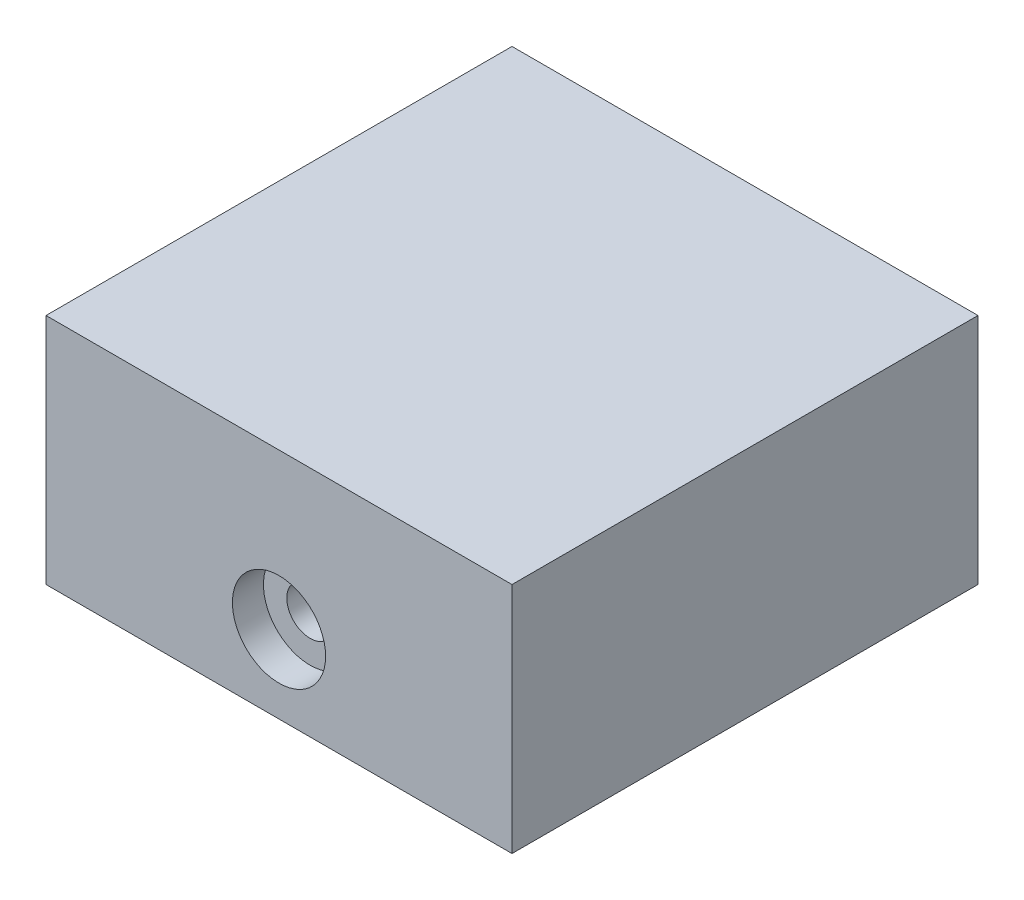
ISO-10303-21;
HEADER;
FILE_DESCRIPTION(('STEP AP214'),'2;1');
FILE_NAME('part.step','',(''),(''),'','','');
FILE_SCHEMA(('AUTOMOTIVE_DESIGN { 1 0 10303 214 1 1 1 1 }'));
ENDSEC;
DATA;
#1=APPLICATION_CONTEXT('core data for automotive mechanical design processes');
#2=APPLICATION_PROTOCOL_DEFINITION('international standard','automotive_design',2000,#1);
#3=PRODUCT_CONTEXT('',#1,'mechanical');
#4=PRODUCT('Part','Part','',(#3));
#5=PRODUCT_RELATED_PRODUCT_CATEGORY('part','',(#4));
#6=PRODUCT_DEFINITION_FORMATION('','',#4);
#7=PRODUCT_DEFINITION_CONTEXT('part definition',#1,'design');
#8=PRODUCT_DEFINITION('design','',#6,#7);
#9=PRODUCT_DEFINITION_SHAPE('','',#8);
#10=(LENGTH_UNIT() NAMED_UNIT(*) SI_UNIT(.MILLI.,.METRE.));
#11=(NAMED_UNIT(*) PLANE_ANGLE_UNIT() SI_UNIT($,.RADIAN.));
#12=(NAMED_UNIT(*) SI_UNIT($,.STERADIAN.) SOLID_ANGLE_UNIT());
#13=UNCERTAINTY_MEASURE_WITH_UNIT(LENGTH_MEASURE(1.E-05),#10,'distance_accuracy_value','');
#14=(GEOMETRIC_REPRESENTATION_CONTEXT(3) GLOBAL_UNCERTAINTY_ASSIGNED_CONTEXT((#13)) GLOBAL_UNIT_ASSIGNED_CONTEXT((#10,
#11,#12)) REPRESENTATION_CONTEXT('',''));
#15=CARTESIAN_POINT('',(0.,0.,0.));
#16=DIRECTION('',(0.,0.,1.));
#17=DIRECTION('',(1.,0.,0.));
#18=AXIS2_PLACEMENT_3D('',#15,#16,#17);
#19=CARTESIAN_POINT('',(0.,5.,15.));
#20=DIRECTION('',(0.,0.,-1.));
#21=DIRECTION('',(-1.,0.,0.));
#22=AXIS2_PLACEMENT_3D('',#19,#20,#21);
#23=CYLINDRICAL_SURFACE('',#22,1.5);
#24=CARTESIAN_POINT('',(0.,5.,10.));
#25=DIRECTION('',(0.,0.,1.));
#26=DIRECTION('',(1.,0.,0.));
#27=AXIS2_PLACEMENT_3D('',#24,#25,#26);
#28=CIRCLE('',#27,1.5);
#29=CARTESIAN_POINT('',(1.5,5.,10.));
#30=VERTEX_POINT('',#29);
#31=EDGE_CURVE('E195',#30,#30,#28,.T.);
#32=ORIENTED_EDGE('',*,*,#31,.F.);
#33=EDGE_LOOP('',(#32));
#34=FACE_BOUND('',#33,.T.);
#35=CARTESIAN_POINT('',(0.,5.,13.));
#36=DIRECTION('',(0.,0.,1.));
#37=DIRECTION('',(1.,0.,0.));
#38=AXIS2_PLACEMENT_3D('',#35,#36,#37);
#39=CIRCLE('',#38,1.5);
#40=CARTESIAN_POINT('',(1.5,5.,13.));
#41=VERTEX_POINT('',#40);
#42=EDGE_CURVE('E37',#41,#41,#39,.F.);
#43=ORIENTED_EDGE('',*,*,#42,.F.);
#44=EDGE_LOOP('',(#43));
#45=FACE_BOUND('',#44,.T.);
#46=ADVANCED_FACE('F33',(#34,#45),#23,.F.);
#47=CARTESIAN_POINT('',(0.,5.,-10.));
#48=DIRECTION('',(0.,0.,-1.));
#49=DIRECTION('',(-1.,0.,0.));
#50=AXIS2_PLACEMENT_3D('',#47,#48,#49);
#51=CIRCLE('',#50,1.5);
#52=CARTESIAN_POINT('',(-1.5,5.,-10.));
#53=VERTEX_POINT('',#52);
#54=EDGE_CURVE('E198',#53,#53,#51,.T.);
#55=ORIENTED_EDGE('',*,*,#54,.F.);
#56=EDGE_LOOP('',(#55));
#57=FACE_BOUND('',#56,.T.);
#58=CARTESIAN_POINT('',(0.,5.,-13.));
#59=DIRECTION('',(0.,0.,-1.));
#60=DIRECTION('',(-1.,0.,0.));
#61=AXIS2_PLACEMENT_3D('',#58,#59,#60);
#62=CIRCLE('',#61,1.5);
#63=CARTESIAN_POINT('',(-1.5,5.,-13.));
#64=VERTEX_POINT('',#63);
#65=EDGE_CURVE('E187',#64,#64,#62,.F.);
#66=ORIENTED_EDGE('',*,*,#65,.F.);
#67=EDGE_LOOP('',(#66));
#68=FACE_BOUND('',#67,.T.);
#69=ADVANCED_FACE('F259',(#57,#68),#23,.F.);
#70=CARTESIAN_POINT('',(15.,15.,-15.));
#71=DIRECTION('',(-1.,0.,0.));
#72=DIRECTION('',(0.,0.,1.));
#73=AXIS2_PLACEMENT_3D('',#70,#71,#72);
#74=PLANE('',#73);
#75=DIRECTION('',(0.,0.,-1.));
#76=VECTOR('',#75,1.);
#77=CARTESIAN_POINT('',(15.,0.,-15.));
#78=LINE('',#77,#76);
#79=CARTESIAN_POINT('',(15.,0.,15.));
#80=VERTEX_POINT('',#79);
#81=CARTESIAN_POINT('',(15.,0.,-15.));
#82=VERTEX_POINT('',#81);
#83=EDGE_CURVE('E224',#80,#82,#78,.T.);
#84=ORIENTED_EDGE('',*,*,#83,.T.);
#85=DIRECTION('',(0.,-1.,0.));
#86=VECTOR('',#85,1.);
#87=CARTESIAN_POINT('',(15.,15.,-15.));
#88=LINE('',#87,#86);
#89=CARTESIAN_POINT('',(15.,15.,-15.));
#90=VERTEX_POINT('',#89);
#91=EDGE_CURVE('E11',#90,#82,#88,.T.);
#92=ORIENTED_EDGE('',*,*,#91,.F.);
#93=DIRECTION('',(0.,0.,-1.));
#94=VECTOR('',#93,1.);
#95=CARTESIAN_POINT('',(15.,15.,-15.));
#96=LINE('',#95,#94);
#97=CARTESIAN_POINT('',(15.,15.,15.));
#98=VERTEX_POINT('',#97);
#99=EDGE_CURVE('E230',#98,#90,#96,.T.);
#100=ORIENTED_EDGE('',*,*,#99,.F.);
#101=DIRECTION('',(0.,-1.,0.));
#102=VECTOR('',#101,1.);
#103=CARTESIAN_POINT('',(15.,15.,15.));
#104=LINE('',#103,#102);
#105=EDGE_CURVE('E240',#98,#80,#104,.T.);
#106=ORIENTED_EDGE('',*,*,#105,.T.);
#107=EDGE_LOOP('',(#84,#92,#100,#106));
#108=FACE_BOUND('',#107,.T.);
#109=ADVANCED_FACE('F35',(#108),#74,.F.);
#110=CARTESIAN_POINT('',(-15.,15.,-15.));
#111=DIRECTION('',(0.,0.,1.));
#112=DIRECTION('',(1.,0.,0.));
#113=AXIS2_PLACEMENT_3D('',#110,#111,#112);
#114=PLANE('',#113);
#115=DIRECTION('',(-0.866025403784438,0.500000000000001,0.));
#116=VECTOR('',#115,1.);
#117=CARTESIAN_POINT('',(0.,2.07075621925769,-15.));
#118=LINE('',#117,#116);
#119=CARTESIAN_POINT('',(0.,2.07075621925769,-15.));
#120=VERTEX_POINT('',#119);
#121=CARTESIAN_POINT('',(-2.53679952800042,3.53537810962885,-15.));
#122=VERTEX_POINT('',#121);
#123=EDGE_CURVE('E175',#120,#122,#118,.T.);
#124=ORIENTED_EDGE('',*,*,#123,.F.);
#125=DIRECTION('',(-0.866025403784442,-0.499999999999995,0.));
#126=VECTOR('',#125,1.);
#127=CARTESIAN_POINT('',(2.5367995280004,3.53537810962881,-15.));
#128=LINE('',#127,#126);
#129=CARTESIAN_POINT('',(2.5367995280004,3.53537810962881,-15.));
#130=VERTEX_POINT('',#129);
#131=EDGE_CURVE('E50',#130,#120,#128,.T.);
#132=ORIENTED_EDGE('',*,*,#131,.F.);
#133=DIRECTION('',(0.,-1.,0.));
#134=VECTOR('',#133,1.);
#135=CARTESIAN_POINT('',(2.53679952800043,6.46462189037113,-15.));
#136=LINE('',#135,#134);
#137=CARTESIAN_POINT('',(2.53679952800043,6.46462189037113,-15.));
#138=VERTEX_POINT('',#137);
#139=EDGE_CURVE('E158',#138,#130,#136,.T.);
#140=ORIENTED_EDGE('',*,*,#139,.F.);
#141=DIRECTION('',(0.866025403784435,-0.500000000000007,0.));
#142=VECTOR('',#141,1.);
#143=CARTESIAN_POINT('',(0.,7.92924378074231,-15.));
#144=LINE('',#143,#142);
#145=CARTESIAN_POINT('',(0.,7.92924378074231,-15.));
#146=VERTEX_POINT('',#145);
#147=EDGE_CURVE('E161',#146,#138,#144,.T.);
#148=ORIENTED_EDGE('',*,*,#147,.F.);
#149=DIRECTION('',(0.866025403784442,0.499999999999995,0.));
#150=VECTOR('',#149,1.);
#151=CARTESIAN_POINT('',(-2.53679952800041,6.46462189037117,-15.));
#152=LINE('',#151,#150);
#153=CARTESIAN_POINT('',(-2.53679952800041,6.46462189037117,-15.));
#154=VERTEX_POINT('',#153);
#155=EDGE_CURVE('E180',#154,#146,#152,.T.);
#156=ORIENTED_EDGE('',*,*,#155,.F.);
#157=DIRECTION('',(0.,1.,0.));
#158=VECTOR('',#157,1.);
#159=CARTESIAN_POINT('',(-2.53679952800042,3.53537810962885,-15.));
#160=LINE('',#159,#158);
#161=EDGE_CURVE('E177',#122,#154,#160,.T.);
#162=ORIENTED_EDGE('',*,*,#161,.F.);
#163=EDGE_LOOP('',(#124,#132,#140,#148,#156,#162));
#164=FACE_BOUND('',#163,.T.);
#165=DIRECTION('',(-1.,0.,0.));
#166=VECTOR('',#165,1.);
#167=CARTESIAN_POINT('',(-15.,0.,-15.));
#168=LINE('',#167,#166);
#169=CARTESIAN_POINT('',(-15.,0.,-15.));
#170=VERTEX_POINT('',#169);
#171=EDGE_CURVE('E243',#82,#170,#168,.T.);
#172=ORIENTED_EDGE('',*,*,#171,.T.);
#173=DIRECTION('',(0.,-1.,0.));
#174=VECTOR('',#173,1.);
#175=CARTESIAN_POINT('',(-15.,15.,-15.));
#176=LINE('',#175,#174);
#177=CARTESIAN_POINT('',(-15.,15.,-15.));
#178=VERTEX_POINT('',#177);
#179=EDGE_CURVE('E42',#178,#170,#176,.T.);
#180=ORIENTED_EDGE('',*,*,#179,.F.);
#181=DIRECTION('',(-1.,0.,0.));
#182=VECTOR('',#181,1.);
#183=CARTESIAN_POINT('',(-15.,15.,-15.));
#184=LINE('',#183,#182);
#185=EDGE_CURVE('E233',#90,#178,#184,.T.);
#186=ORIENTED_EDGE('',*,*,#185,.F.);
#187=ORIENTED_EDGE('',*,*,#91,.T.);
#188=EDGE_LOOP('',(#172,#180,#186,#187));
#189=FACE_BOUND('',#188,.T.);
#190=ADVANCED_FACE('F267',(#164,#189),#114,.F.);
#191=CARTESIAN_POINT('',(-15.,15.,-15.));
#192=DIRECTION('',(1.,0.,0.));
#193=DIRECTION('',(0.,0.,-1.));
#194=AXIS2_PLACEMENT_3D('',#191,#192,#193);
#195=PLANE('',#194);
#196=DIRECTION('',(0.,0.,1.));
#197=VECTOR('',#196,1.);
#198=CARTESIAN_POINT('',(-15.,0.,-15.));
#199=LINE('',#198,#197);
#200=CARTESIAN_POINT('',(-15.,0.,15.));
#201=VERTEX_POINT('',#200);
#202=EDGE_CURVE('E245',#170,#201,#199,.T.);
#203=ORIENTED_EDGE('',*,*,#202,.T.);
#204=DIRECTION('',(0.,-1.,0.));
#205=VECTOR('',#204,1.);
#206=CARTESIAN_POINT('',(-15.,15.,15.));
#207=LINE('',#206,#205);
#208=CARTESIAN_POINT('',(-15.,15.,15.));
#209=VERTEX_POINT('',#208);
#210=EDGE_CURVE('E250',#209,#201,#207,.T.);
#211=ORIENTED_EDGE('',*,*,#210,.F.);
#212=DIRECTION('',(0.,0.,1.));
#213=VECTOR('',#212,1.);
#214=CARTESIAN_POINT('',(-15.,15.,-15.));
#215=LINE('',#214,#213);
#216=EDGE_CURVE('E236',#178,#209,#215,.T.);
#217=ORIENTED_EDGE('',*,*,#216,.F.);
#218=ORIENTED_EDGE('',*,*,#179,.T.);
#219=EDGE_LOOP('',(#203,#211,#217,#218));
#220=FACE_BOUND('',#219,.T.);
#221=ADVANCED_FACE('F304',(#220),#195,.F.);
#222=CARTESIAN_POINT('',(-15.,15.,15.));
#223=DIRECTION('',(0.,0.,-1.));
#224=DIRECTION('',(-1.,0.,0.));
#225=AXIS2_PLACEMENT_3D('',#222,#223,#224);
#226=PLANE('',#225);
#227=CARTESIAN_POINT('',(0.,5.,15.));
#228=DIRECTION('',(0.,0.,1.));
#229=DIRECTION('',(1.,0.,0.));
#230=AXIS2_PLACEMENT_3D('',#227,#228,#229);
#231=CIRCLE('',#230,3.);
#232=CARTESIAN_POINT('',(3.,5.,15.));
#233=VERTEX_POINT('',#232);
#234=EDGE_CURVE('E164',#233,#233,#231,.T.);
#235=ORIENTED_EDGE('',*,*,#234,.F.);
#236=EDGE_LOOP('',(#235));
#237=FACE_BOUND('',#236,.T.);
#238=DIRECTION('',(1.,0.,0.));
#239=VECTOR('',#238,1.);
#240=CARTESIAN_POINT('',(-15.,0.,15.));
#241=LINE('',#240,#239);
#242=EDGE_CURVE('E234',#201,#80,#241,.T.);
#243=ORIENTED_EDGE('',*,*,#242,.T.);
#244=ORIENTED_EDGE('',*,*,#105,.F.);
#245=DIRECTION('',(1.,0.,0.));
#246=VECTOR('',#245,1.);
#247=CARTESIAN_POINT('',(-15.,15.,15.));
#248=LINE('',#247,#246);
#249=EDGE_CURVE('E238',#209,#98,#248,.T.);
#250=ORIENTED_EDGE('',*,*,#249,.F.);
#251=ORIENTED_EDGE('',*,*,#210,.T.);
#252=EDGE_LOOP('',(#243,#244,#250,#251));
#253=FACE_BOUND('',#252,.T.);
#254=ADVANCED_FACE('F297',(#237,#253),#226,.F.);
#255=CARTESIAN_POINT('',(0.,15.,0.));
#256=DIRECTION('',(0.,1.,0.));
#257=DIRECTION('',(0.,0.,1.));
#258=AXIS2_PLACEMENT_3D('',#255,#256,#257);
#259=PLANE('',#258);
#260=ORIENTED_EDGE('',*,*,#99,.T.);
#261=ORIENTED_EDGE('',*,*,#185,.T.);
#262=ORIENTED_EDGE('',*,*,#216,.T.);
#263=ORIENTED_EDGE('',*,*,#249,.T.);
#264=EDGE_LOOP('',(#260,#261,#262,#263));
#265=FACE_BOUND('',#264,.T.);
#266=ADVANCED_FACE('F294',(#265),#259,.T.);
#267=CARTESIAN_POINT('',(0.,0.,0.));
#268=DIRECTION('',(0.,1.,0.));
#269=DIRECTION('',(0.,0.,1.));
#270=AXIS2_PLACEMENT_3D('',#267,#268,#269);
#271=PLANE('',#270);
#272=DIRECTION('',(1.,0.,0.));
#273=VECTOR('',#272,1.);
#274=CARTESIAN_POINT('',(10.,0.,-10.));
#275=LINE('',#274,#273);
#276=CARTESIAN_POINT('',(-10.,0.,-10.));
#277=VERTEX_POINT('',#276);
#278=CARTESIAN_POINT('',(10.,0.,-10.));
#279=VERTEX_POINT('',#278);
#280=EDGE_CURVE('E214',#277,#279,#275,.T.);
#281=ORIENTED_EDGE('',*,*,#280,.F.);
#282=DIRECTION('',(0.,0.,-1.));
#283=VECTOR('',#282,1.);
#284=CARTESIAN_POINT('',(-10.,0.,10.));
#285=LINE('',#284,#283);
#286=CARTESIAN_POINT('',(-10.,0.,10.));
#287=VERTEX_POINT('',#286);
#288=EDGE_CURVE('E58',#287,#277,#285,.T.);
#289=ORIENTED_EDGE('',*,*,#288,.F.);
#290=DIRECTION('',(-1.,0.,0.));
#291=VECTOR('',#290,1.);
#292=CARTESIAN_POINT('',(10.,0.,10.));
#293=LINE('',#292,#291);
#294=CARTESIAN_POINT('',(10.,0.,10.));
#295=VERTEX_POINT('',#294);
#296=EDGE_CURVE('E203',#295,#287,#293,.T.);
#297=ORIENTED_EDGE('',*,*,#296,.F.);
#298=DIRECTION('',(0.,0.,1.));
#299=VECTOR('',#298,1.);
#300=CARTESIAN_POINT('',(10.,0.,10.));
#301=LINE('',#300,#299);
#302=EDGE_CURVE('E217',#279,#295,#301,.T.);
#303=ORIENTED_EDGE('',*,*,#302,.F.);
#304=EDGE_LOOP('',(#281,#289,#297,#303));
#305=FACE_BOUND('',#304,.T.);
#306=ORIENTED_EDGE('',*,*,#83,.F.);
#307=ORIENTED_EDGE('',*,*,#242,.F.);
#308=ORIENTED_EDGE('',*,*,#202,.F.);
#309=ORIENTED_EDGE('',*,*,#171,.F.);
#310=EDGE_LOOP('',(#306,#307,#308,#309));
#311=FACE_BOUND('',#310,.T.);
#312=ADVANCED_FACE('F293',(#305,#311),#271,.F.);
#313=CARTESIAN_POINT('',(-10.,10.,10.));
#314=DIRECTION('',(-1.,0.,0.));
#315=DIRECTION('',(0.,0.,1.));
#316=AXIS2_PLACEMENT_3D('',#313,#314,#315);
#317=PLANE('',#316);
#318=ORIENTED_EDGE('',*,*,#288,.T.);
#319=DIRECTION('',(0.,-1.,0.));
#320=VECTOR('',#319,1.);
#321=CARTESIAN_POINT('',(-10.,10.,-10.));
#322=LINE('',#321,#320);
#323=CARTESIAN_POINT('',(-10.,10.,-10.));
#324=VERTEX_POINT('',#323);
#325=EDGE_CURVE('E212',#324,#277,#322,.T.);
#326=ORIENTED_EDGE('',*,*,#325,.F.);
#327=DIRECTION('',(0.,0.,-1.));
#328=VECTOR('',#327,1.);
#329=CARTESIAN_POINT('',(-10.,10.,10.));
#330=LINE('',#329,#328);
#331=CARTESIAN_POINT('',(-10.,10.,10.));
#332=VERTEX_POINT('',#331);
#333=EDGE_CURVE('E199',#332,#324,#330,.T.);
#334=ORIENTED_EDGE('',*,*,#333,.F.);
#335=DIRECTION('',(0.,-1.,0.));
#336=VECTOR('',#335,1.);
#337=CARTESIAN_POINT('',(-10.,10.,10.));
#338=LINE('',#337,#336);
#339=EDGE_CURVE('E222',#332,#287,#338,.T.);
#340=ORIENTED_EDGE('',*,*,#339,.T.);
#341=EDGE_LOOP('',(#318,#326,#334,#340));
#342=FACE_BOUND('',#341,.T.);
#343=ADVANCED_FACE('F283',(#342),#317,.F.);
#344=CARTESIAN_POINT('',(10.,10.,10.));
#345=DIRECTION('',(0.,0.,1.));
#346=DIRECTION('',(1.,0.,0.));
#347=AXIS2_PLACEMENT_3D('',#344,#345,#346);
#348=PLANE('',#347);
#349=ORIENTED_EDGE('',*,*,#31,.T.);
#350=EDGE_LOOP('',(#349));
#351=FACE_BOUND('',#350,.T.);
#352=ORIENTED_EDGE('',*,*,#296,.T.);
#353=ORIENTED_EDGE('',*,*,#339,.F.);
#354=DIRECTION('',(-1.,0.,0.));
#355=VECTOR('',#354,1.);
#356=CARTESIAN_POINT('',(10.,10.,10.));
#357=LINE('',#356,#355);
#358=CARTESIAN_POINT('',(10.,10.,10.));
#359=VERTEX_POINT('',#358);
#360=EDGE_CURVE('E209',#359,#332,#357,.T.);
#361=ORIENTED_EDGE('',*,*,#360,.F.);
#362=DIRECTION('',(0.,-1.,0.));
#363=VECTOR('',#362,1.);
#364=CARTESIAN_POINT('',(10.,10.,10.));
#365=LINE('',#364,#363);
#366=EDGE_CURVE('E225',#359,#295,#365,.T.);
#367=ORIENTED_EDGE('',*,*,#366,.T.);
#368=EDGE_LOOP('',(#352,#353,#361,#367));
#369=FACE_BOUND('',#368,.T.);
#370=ADVANCED_FACE('F279',(#351,#369),#348,.F.);
#371=CARTESIAN_POINT('',(10.,10.,10.));
#372=DIRECTION('',(1.,0.,0.));
#373=DIRECTION('',(0.,0.,-1.));
#374=AXIS2_PLACEMENT_3D('',#371,#372,#373);
#375=PLANE('',#374);
#376=ORIENTED_EDGE('',*,*,#302,.T.);
#377=ORIENTED_EDGE('',*,*,#366,.F.);
#378=DIRECTION('',(0.,0.,1.));
#379=VECTOR('',#378,1.);
#380=CARTESIAN_POINT('',(10.,10.,10.));
#381=LINE('',#380,#379);
#382=CARTESIAN_POINT('',(10.,10.,-10.));
#383=VERTEX_POINT('',#382);
#384=EDGE_CURVE('E206',#383,#359,#381,.T.);
#385=ORIENTED_EDGE('',*,*,#384,.F.);
#386=DIRECTION('',(0.,-1.,0.));
#387=VECTOR('',#386,1.);
#388=CARTESIAN_POINT('',(10.,10.,-10.));
#389=LINE('',#388,#387);
#390=EDGE_CURVE('E227',#383,#279,#389,.T.);
#391=ORIENTED_EDGE('',*,*,#390,.T.);
#392=EDGE_LOOP('',(#376,#377,#385,#391));
#393=FACE_BOUND('',#392,.T.);
#394=ADVANCED_FACE('F282',(#393),#375,.F.);
#395=CARTESIAN_POINT('',(10.,10.,-10.));
#396=DIRECTION('',(0.,0.,-1.));
#397=DIRECTION('',(-1.,0.,0.));
#398=AXIS2_PLACEMENT_3D('',#395,#396,#397);
#399=PLANE('',#398);
#400=ORIENTED_EDGE('',*,*,#54,.T.);
#401=EDGE_LOOP('',(#400));
#402=FACE_BOUND('',#401,.T.);
#403=ORIENTED_EDGE('',*,*,#280,.T.);
#404=ORIENTED_EDGE('',*,*,#390,.F.);
#405=DIRECTION('',(1.,0.,0.));
#406=VECTOR('',#405,1.);
#407=CARTESIAN_POINT('',(10.,10.,-10.));
#408=LINE('',#407,#406);
#409=EDGE_CURVE('E202',#324,#383,#408,.T.);
#410=ORIENTED_EDGE('',*,*,#409,.F.);
#411=ORIENTED_EDGE('',*,*,#325,.T.);
#412=EDGE_LOOP('',(#403,#404,#410,#411));
#413=FACE_BOUND('',#412,.T.);
#414=ADVANCED_FACE('F277',(#402,#413),#399,.F.);
#415=CARTESIAN_POINT('',(0.,10.,0.));
#416=DIRECTION('',(0.,1.,0.));
#417=DIRECTION('',(0.,0.,1.));
#418=AXIS2_PLACEMENT_3D('',#415,#416,#417);
#419=PLANE('',#418);
#420=ORIENTED_EDGE('',*,*,#333,.T.);
#421=ORIENTED_EDGE('',*,*,#409,.T.);
#422=ORIENTED_EDGE('',*,*,#384,.T.);
#423=ORIENTED_EDGE('',*,*,#360,.T.);
#424=EDGE_LOOP('',(#420,#421,#422,#423));
#425=FACE_BOUND('',#424,.T.);
#426=ADVANCED_FACE('F274',(#425),#419,.F.);
#427=CARTESIAN_POINT('',(0.,0.,-13.));
#428=DIRECTION('',(0.,0.,-1.));
#429=DIRECTION('',(-1.,0.,0.));
#430=AXIS2_PLACEMENT_3D('',#427,#428,#429);
#431=PLANE('',#430);
#432=DIRECTION('',(-0.866025403784442,-0.499999999999995,0.));
#433=VECTOR('',#432,1.);
#434=CARTESIAN_POINT('',(2.5367995280004,3.53537810962881,-13.));
#435=LINE('',#434,#433);
#436=CARTESIAN_POINT('',(2.5367995280004,3.53537810962881,-13.));
#437=VERTEX_POINT('',#436);
#438=CARTESIAN_POINT('',(0.,2.07075621925769,-13.));
#439=VERTEX_POINT('',#438);
#440=EDGE_CURVE('E138',#437,#439,#435,.T.);
#441=ORIENTED_EDGE('',*,*,#440,.T.);
#442=DIRECTION('',(-0.866025403784438,0.500000000000001,0.));
#443=VECTOR('',#442,1.);
#444=CARTESIAN_POINT('',(0.,2.07075621925769,-13.));
#445=LINE('',#444,#443);
#446=CARTESIAN_POINT('',(-2.53679952800042,3.53537810962885,-13.));
#447=VERTEX_POINT('',#446);
#448=EDGE_CURVE('E147',#439,#447,#445,.T.);
#449=ORIENTED_EDGE('',*,*,#448,.T.);
#450=DIRECTION('',(0.,1.,0.));
#451=VECTOR('',#450,1.);
#452=CARTESIAN_POINT('',(-2.53679952800042,3.53537810962885,-13.));
#453=LINE('',#452,#451);
#454=CARTESIAN_POINT('',(-2.53679952800041,6.46462189037117,-13.));
#455=VERTEX_POINT('',#454);
#456=EDGE_CURVE('E152',#447,#455,#453,.T.);
#457=ORIENTED_EDGE('',*,*,#456,.T.);
#458=DIRECTION('',(0.866025403784442,0.499999999999995,0.));
#459=VECTOR('',#458,1.);
#460=CARTESIAN_POINT('',(-2.53679952800041,6.46462189037117,-13.));
#461=LINE('',#460,#459);
#462=CARTESIAN_POINT('',(0.,7.92924378074231,-13.));
#463=VERTEX_POINT('',#462);
#464=EDGE_CURVE('E168',#455,#463,#461,.T.);
#465=ORIENTED_EDGE('',*,*,#464,.T.);
#466=DIRECTION('',(0.866025403784435,-0.500000000000007,0.));
#467=VECTOR('',#466,1.);
#468=CARTESIAN_POINT('',(0.,7.92924378074231,-13.));
#469=LINE('',#468,#467);
#470=CARTESIAN_POINT('',(2.53679952800043,6.46462189037113,-13.));
#471=VERTEX_POINT('',#470);
#472=EDGE_CURVE('E171',#463,#471,#469,.T.);
#473=ORIENTED_EDGE('',*,*,#472,.T.);
#474=DIRECTION('',(0.,-1.,0.));
#475=VECTOR('',#474,1.);
#476=CARTESIAN_POINT('',(2.53679952800043,6.46462189037113,-13.));
#477=LINE('',#476,#475);
#478=EDGE_CURVE('E144',#471,#437,#477,.T.);
#479=ORIENTED_EDGE('',*,*,#478,.T.);
#480=EDGE_LOOP('',(#441,#449,#457,#465,#473,#479));
#481=FACE_BOUND('',#480,.T.);
#482=ORIENTED_EDGE('',*,*,#65,.T.);
#483=EDGE_LOOP('',(#482));
#484=FACE_BOUND('',#483,.T.);
#485=ADVANCED_FACE('F154',(#481,#484),#431,.T.);
#486=CARTESIAN_POINT('',(2.5367995280004,3.53537810962881,-13.));
#487=DIRECTION('',(0.499999999999995,-0.866025403784442,0.));
#488=DIRECTION('',(0.866025403784442,0.499999999999995,0.));
#489=AXIS2_PLACEMENT_3D('',#486,#487,#488);
#490=PLANE('',#489);
#491=ORIENTED_EDGE('',*,*,#131,.T.);
#492=DIRECTION('',(0.,0.,-1.));
#493=VECTOR('',#492,1.);
#494=CARTESIAN_POINT('',(0.,2.07075621925769,-13.));
#495=LINE('',#494,#493);
#496=EDGE_CURVE('E134',#439,#120,#495,.T.);
#497=ORIENTED_EDGE('',*,*,#496,.F.);
#498=ORIENTED_EDGE('',*,*,#440,.F.);
#499=DIRECTION('',(0.,0.,-1.));
#500=VECTOR('',#499,1.);
#501=CARTESIAN_POINT('',(2.5367995280004,3.53537810962881,-13.));
#502=LINE('',#501,#500);
#503=EDGE_CURVE('E185',#437,#130,#502,.T.);
#504=ORIENTED_EDGE('',*,*,#503,.T.);
#505=EDGE_LOOP('',(#491,#497,#498,#504));
#506=FACE_BOUND('',#505,.T.);
#507=ADVANCED_FACE('F136',(#506),#490,.F.);
#508=CARTESIAN_POINT('',(2.53679952800043,6.46462189037113,-13.));
#509=DIRECTION('',(1.,0.,0.));
#510=DIRECTION('',(0.,1.,0.));
#511=AXIS2_PLACEMENT_3D('',#508,#509,#510);
#512=PLANE('',#511);
#513=ORIENTED_EDGE('',*,*,#139,.T.);
#514=ORIENTED_EDGE('',*,*,#503,.F.);
#515=ORIENTED_EDGE('',*,*,#478,.F.);
#516=DIRECTION('',(0.,0.,-1.));
#517=VECTOR('',#516,1.);
#518=CARTESIAN_POINT('',(2.53679952800043,6.46462189037113,-13.));
#519=LINE('',#518,#517);
#520=EDGE_CURVE('E188',#471,#138,#519,.T.);
#521=ORIENTED_EDGE('',*,*,#520,.T.);
#522=EDGE_LOOP('',(#513,#514,#515,#521));
#523=FACE_BOUND('',#522,.T.);
#524=ADVANCED_FACE('F338',(#523),#512,.F.);
#525=CARTESIAN_POINT('',(0.,7.92924378074231,-13.));
#526=DIRECTION('',(0.500000000000007,0.866025403784435,0.));
#527=DIRECTION('',(-0.866025403784435,0.500000000000007,0.));
#528=AXIS2_PLACEMENT_3D('',#525,#526,#527);
#529=PLANE('',#528);
#530=ORIENTED_EDGE('',*,*,#147,.T.);
#531=ORIENTED_EDGE('',*,*,#520,.F.);
#532=ORIENTED_EDGE('',*,*,#472,.F.);
#533=DIRECTION('',(0.,0.,-1.));
#534=VECTOR('',#533,1.);
#535=CARTESIAN_POINT('',(0.,7.92924378074231,-13.));
#536=LINE('',#535,#534);
#537=EDGE_CURVE('E190',#463,#146,#536,.T.);
#538=ORIENTED_EDGE('',*,*,#537,.T.);
#539=EDGE_LOOP('',(#530,#531,#532,#538));
#540=FACE_BOUND('',#539,.T.);
#541=ADVANCED_FACE('F336',(#540),#529,.F.);
#542=CARTESIAN_POINT('',(-2.53679952800041,6.46462189037117,-13.));
#543=DIRECTION('',(-0.499999999999995,0.866025403784442,0.));
#544=DIRECTION('',(-0.866025403784442,-0.499999999999995,0.));
#545=AXIS2_PLACEMENT_3D('',#542,#543,#544);
#546=PLANE('',#545);
#547=ORIENTED_EDGE('',*,*,#155,.T.);
#548=ORIENTED_EDGE('',*,*,#537,.F.);
#549=ORIENTED_EDGE('',*,*,#464,.F.);
#550=DIRECTION('',(0.,0.,-1.));
#551=VECTOR('',#550,1.);
#552=CARTESIAN_POINT('',(-2.53679952800041,6.46462189037117,-13.));
#553=LINE('',#552,#551);
#554=EDGE_CURVE('E192',#455,#154,#553,.T.);
#555=ORIENTED_EDGE('',*,*,#554,.T.);
#556=EDGE_LOOP('',(#547,#548,#549,#555));
#557=FACE_BOUND('',#556,.T.);
#558=ADVANCED_FACE('F334',(#557),#546,.F.);
#559=CARTESIAN_POINT('',(-2.53679952800042,3.53537810962885,-13.));
#560=DIRECTION('',(-1.,0.,0.));
#561=DIRECTION('',(0.,-1.,0.));
#562=AXIS2_PLACEMENT_3D('',#559,#560,#561);
#563=PLANE('',#562);
#564=ORIENTED_EDGE('',*,*,#161,.T.);
#565=ORIENTED_EDGE('',*,*,#554,.F.);
#566=ORIENTED_EDGE('',*,*,#456,.F.);
#567=DIRECTION('',(0.,0.,-1.));
#568=VECTOR('',#567,1.);
#569=CARTESIAN_POINT('',(-2.53679952800042,3.53537810962885,-13.));
#570=LINE('',#569,#568);
#571=EDGE_CURVE('E143',#447,#122,#570,.T.);
#572=ORIENTED_EDGE('',*,*,#571,.T.);
#573=EDGE_LOOP('',(#564,#565,#566,#572));
#574=FACE_BOUND('',#573,.T.);
#575=ADVANCED_FACE('F330',(#574),#563,.F.);
#576=CARTESIAN_POINT('',(0.,2.07075621925769,-13.));
#577=DIRECTION('',(-0.500000000000001,-0.866025403784438,0.));
#578=DIRECTION('',(0.866025403784438,-0.500000000000001,0.));
#579=AXIS2_PLACEMENT_3D('',#576,#577,#578);
#580=PLANE('',#579);
#581=ORIENTED_EDGE('',*,*,#123,.T.);
#582=ORIENTED_EDGE('',*,*,#571,.F.);
#583=ORIENTED_EDGE('',*,*,#448,.F.);
#584=ORIENTED_EDGE('',*,*,#496,.T.);
#585=EDGE_LOOP('',(#581,#582,#583,#584));
#586=FACE_BOUND('',#585,.T.);
#587=ADVANCED_FACE('F148',(#586),#580,.F.);
#588=CARTESIAN_POINT('',(0.,5.,13.));
#589=DIRECTION('',(0.,0.,1.));
#590=DIRECTION('',(1.,0.,0.));
#591=AXIS2_PLACEMENT_3D('',#588,#589,#590);
#592=PLANE('',#591);
#593=CARTESIAN_POINT('',(0.,5.,13.));
#594=DIRECTION('',(0.,0.,1.));
#595=DIRECTION('',(1.,0.,0.));
#596=AXIS2_PLACEMENT_3D('',#593,#594,#595);
#597=CIRCLE('',#596,3.);
#598=CARTESIAN_POINT('',(3.,5.,13.));
#599=VERTEX_POINT('',#598);
#600=EDGE_CURVE('E367',#599,#599,#597,.T.);
#601=ORIENTED_EDGE('',*,*,#600,.T.);
#602=EDGE_LOOP('',(#601));
#603=FACE_BOUND('',#602,.T.);
#604=ORIENTED_EDGE('',*,*,#42,.T.);
#605=EDGE_LOOP('',(#604));
#606=FACE_BOUND('',#605,.T.);
#607=ADVANCED_FACE('F353',(#603,#606),#592,.T.);
#608=CARTESIAN_POINT('',(0.,5.,13.));
#609=DIRECTION('',(0.,0.,1.));
#610=DIRECTION('',(1.,0.,0.));
#611=AXIS2_PLACEMENT_3D('',#608,#609,#610);
#612=CYLINDRICAL_SURFACE('',#611,3.);
#613=ORIENTED_EDGE('',*,*,#600,.F.);
#614=EDGE_LOOP('',(#613));
#615=FACE_BOUND('',#614,.T.);
#616=ORIENTED_EDGE('',*,*,#234,.T.);
#617=EDGE_LOOP('',(#616));
#618=FACE_BOUND('',#617,.T.);
#619=ADVANCED_FACE('F357',(#615,#618),#612,.F.);
#620=CLOSED_SHELL('',(#46,#69,#109,#190,#221,#254,#266,#312,#343,#370,#394,#414,#426,#485,#507,
#524,#541,#558,#575,#587,#607,#619));
#621=MANIFOLD_SOLID_BREP('B2',#620);
#622=ADVANCED_BREP_SHAPE_REPRESENTATION('',(#18,#621),#14);
#623=SHAPE_DEFINITION_REPRESENTATION(#9,#622);
ENDSEC;
END-ISO-10303-21;
